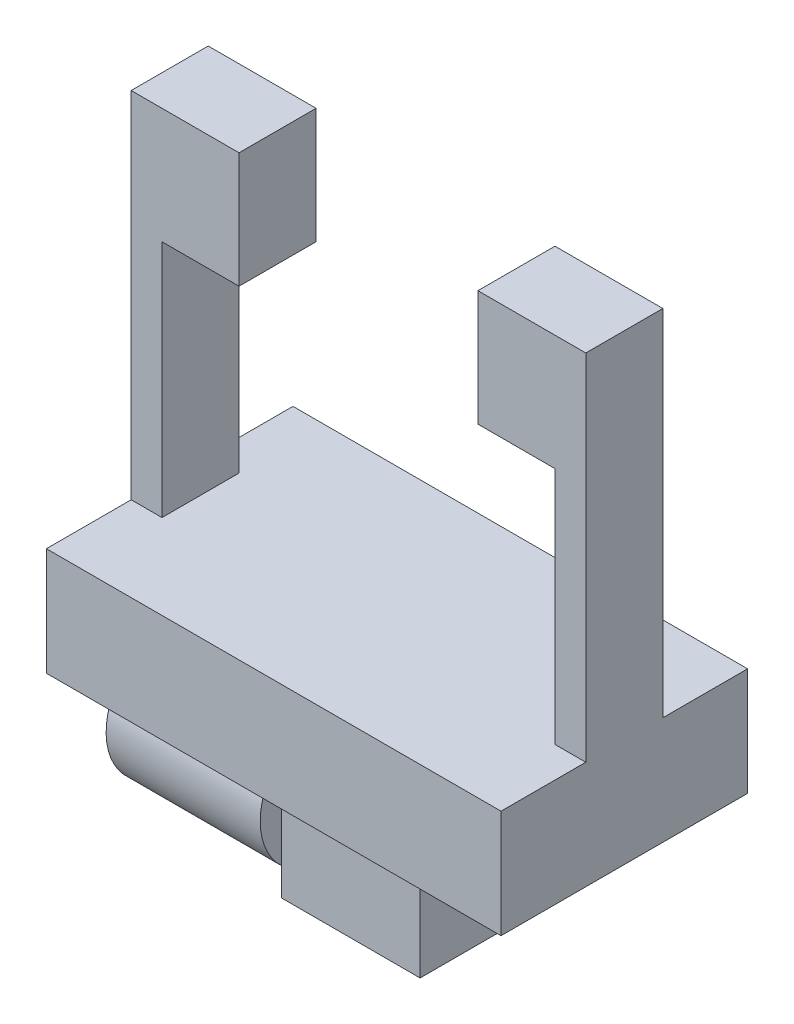
ISO-10303-21;
HEADER;
FILE_DESCRIPTION(('STEP AP214'),'2;1');
FILE_NAME('part.step','',(''),(''),'','','');
FILE_SCHEMA(('AUTOMOTIVE_DESIGN { 1 0 10303 214 1 1 1 1 }'));
ENDSEC;
DATA;
#1=APPLICATION_CONTEXT('core data for automotive mechanical design processes');
#2=APPLICATION_PROTOCOL_DEFINITION('international standard','automotive_design',2000,#1);
#3=PRODUCT_CONTEXT('',#1,'mechanical');
#4=PRODUCT('Part','Part','',(#3));
#5=PRODUCT_RELATED_PRODUCT_CATEGORY('part','',(#4));
#6=PRODUCT_DEFINITION_FORMATION('','',#4);
#7=PRODUCT_DEFINITION_CONTEXT('part definition',#1,'design');
#8=PRODUCT_DEFINITION('design','',#6,#7);
#9=PRODUCT_DEFINITION_SHAPE('','',#8);
#10=(LENGTH_UNIT() NAMED_UNIT(*) SI_UNIT(.MILLI.,.METRE.));
#11=(NAMED_UNIT(*) PLANE_ANGLE_UNIT() SI_UNIT($,.RADIAN.));
#12=(NAMED_UNIT(*) SI_UNIT($,.STERADIAN.) SOLID_ANGLE_UNIT());
#13=UNCERTAINTY_MEASURE_WITH_UNIT(LENGTH_MEASURE(1.E-05),#10,'distance_accuracy_value','');
#14=(GEOMETRIC_REPRESENTATION_CONTEXT(3) GLOBAL_UNCERTAINTY_ASSIGNED_CONTEXT((#13)) GLOBAL_UNIT_ASSIGNED_CONTEXT((#10,
#11,#12)) REPRESENTATION_CONTEXT('',''));
#15=CARTESIAN_POINT('',(0.,0.,0.));
#16=DIRECTION('',(0.,0.,1.));
#17=DIRECTION('',(1.,0.,0.));
#18=AXIS2_PLACEMENT_3D('',#15,#16,#17);
#19=CARTESIAN_POINT('',(-11.43,-8.89,7.62));
#20=DIRECTION('',(1.,0.,0.));
#21=DIRECTION('',(0.,1.,0.));
#22=AXIS2_PLACEMENT_3D('',#19,#20,#21);
#23=PLANE('',#22);
#24=CARTESIAN_POINT('',(-11.43,-21.59,0.));
#25=DIRECTION('',(-1.,0.,0.));
#26=DIRECTION('',(0.,-1.,0.));
#27=AXIS2_PLACEMENT_3D('',#24,#25,#26);
#28=CIRCLE('',#27,11.1125);
#29=CARTESIAN_POINT('',(-11.43,-13.5015356061858,7.62));
#30=VERTEX_POINT('',#29);
#31=CARTESIAN_POINT('',(-11.43,-13.5015356061858,-7.62));
#32=VERTEX_POINT('',#31);
#33=EDGE_CURVE('E1946',#30,#32,#28,.T.);
#34=ORIENTED_EDGE('',*,*,#33,.F.);
#35=DIRECTION('',(0.,-1.,0.));
#36=VECTOR('',#35,1.);
#37=CARTESIAN_POINT('',(-11.43,-8.89,7.62));
#38=LINE('',#37,#36);
#39=CARTESIAN_POINT('',(-11.43,-8.89,7.62));
#40=VERTEX_POINT('',#39);
#41=EDGE_CURVE('E2090',#40,#30,#38,.T.);
#42=ORIENTED_EDGE('',*,*,#41,.F.);
#43=DIRECTION('',(0.,0.,-1.));
#44=VECTOR('',#43,1.);
#45=CARTESIAN_POINT('',(-11.43,-8.89,7.62));
#46=LINE('',#45,#44);
#47=CARTESIAN_POINT('',(-11.43,-8.89,-7.62));
#48=VERTEX_POINT('',#47);
#49=EDGE_CURVE('E2129',#40,#48,#46,.T.);
#50=ORIENTED_EDGE('',*,*,#49,.T.);
#51=DIRECTION('',(0.,-1.,0.));
#52=VECTOR('',#51,1.);
#53=CARTESIAN_POINT('',(-11.43,-8.89,-7.62));
#54=LINE('',#53,#52);
#55=EDGE_CURVE('E2131',#48,#32,#54,.T.);
#56=ORIENTED_EDGE('',*,*,#55,.T.);
#57=EDGE_LOOP('',(#34,#42,#50,#56));
#58=FACE_BOUND('',#57,.T.);
#59=ADVANCED_FACE('F1932',(#58),#23,.F.);
#60=CARTESIAN_POINT('',(37.465,-8.89,20.32));
#61=DIRECTION('',(-1.,0.,0.));
#62=DIRECTION('',(0.,0.,1.));
#63=AXIS2_PLACEMENT_3D('',#60,#61,#62);
#64=PLANE('',#63);
#65=DIRECTION('',(0.,1.,0.));
#66=VECTOR('',#65,1.);
#67=CARTESIAN_POINT('',(37.465,-8.89,-20.32));
#68=LINE('',#67,#66);
#69=CARTESIAN_POINT('',(37.465,-8.89,-20.32));
#70=VERTEX_POINT('',#69);
#71=CARTESIAN_POINT('',(37.465,8.89,-20.32));
#72=VERTEX_POINT('',#71);
#73=EDGE_CURVE('E2251',#70,#72,#68,.T.);
#74=ORIENTED_EDGE('',*,*,#73,.T.);
#75=DIRECTION('',(0.,0.,-1.));
#76=VECTOR('',#75,1.);
#77=CARTESIAN_POINT('',(37.465,8.89,20.32));
#78=LINE('',#77,#76);
#79=CARTESIAN_POINT('',(37.465,8.89,-6.35));
#80=VERTEX_POINT('',#79);
#81=EDGE_CURVE('E1944',#80,#72,#78,.T.);
#82=ORIENTED_EDGE('',*,*,#81,.F.);
#83=DIRECTION('',(0.,1.,0.));
#84=VECTOR('',#83,1.);
#85=CARTESIAN_POINT('',(37.465,8.89,-6.35));
#86=LINE('',#85,#84);
#87=CARTESIAN_POINT('',(37.465,67.31,-6.35));
#88=VERTEX_POINT('',#87);
#89=EDGE_CURVE('E2238',#80,#88,#86,.T.);
#90=ORIENTED_EDGE('',*,*,#89,.T.);
#91=DIRECTION('',(0.,0.,-1.));
#92=VECTOR('',#91,1.);
#93=CARTESIAN_POINT('',(37.465,67.31,6.35));
#94=LINE('',#93,#92);
#95=CARTESIAN_POINT('',(37.465,67.31,6.35));
#96=VERTEX_POINT('',#95);
#97=EDGE_CURVE('E2186',#96,#88,#94,.T.);
#98=ORIENTED_EDGE('',*,*,#97,.F.);
#99=DIRECTION('',(0.,1.,0.));
#100=VECTOR('',#99,1.);
#101=CARTESIAN_POINT('',(37.465,8.89,6.35));
#102=LINE('',#101,#100);
#103=CARTESIAN_POINT('',(37.465,8.89,6.35));
#104=VERTEX_POINT('',#103);
#105=EDGE_CURVE('E2264',#104,#96,#102,.T.);
#106=ORIENTED_EDGE('',*,*,#105,.F.);
#107=CARTESIAN_POINT('',(37.465,8.89,20.32));
#108=VERTEX_POINT('',#107);
#109=EDGE_CURVE('E12',#108,#104,#78,.T.);
#110=ORIENTED_EDGE('',*,*,#109,.F.);
#111=DIRECTION('',(0.,1.,0.));
#112=VECTOR('',#111,1.);
#113=CARTESIAN_POINT('',(37.465,-8.89,20.32));
#114=LINE('',#113,#112);
#115=CARTESIAN_POINT('',(37.465,-8.89,20.32));
#116=VERTEX_POINT('',#115);
#117=EDGE_CURVE('E2280',#116,#108,#114,.T.);
#118=ORIENTED_EDGE('',*,*,#117,.F.);
#119=DIRECTION('',(0.,0.,-1.));
#120=VECTOR('',#119,1.);
#121=CARTESIAN_POINT('',(37.465,-8.89,20.32));
#122=LINE('',#121,#120);
#123=EDGE_CURVE('E2294',#116,#70,#122,.T.);
#124=ORIENTED_EDGE('',*,*,#123,.T.);
#125=EDGE_LOOP('',(#74,#82,#90,#98,#106,#110,#118,#124));
#126=FACE_BOUND('',#125,.T.);
#127=ADVANCED_FACE('F1936',(#126),#64,.F.);
#128=CARTESIAN_POINT('',(-37.465,8.89,20.32));
#129=DIRECTION('',(0.,-1.,0.));
#130=DIRECTION('',(0.,0.,-1.));
#131=AXIS2_PLACEMENT_3D('',#128,#129,#130);
#132=PLANE('',#131);
#133=DIRECTION('',(0.,0.,-1.));
#134=VECTOR('',#133,1.);
#135=CARTESIAN_POINT('',(-37.465,8.89,20.32));
#136=LINE('',#135,#134);
#137=CARTESIAN_POINT('',(-37.465,8.89,-6.35));
#138=VERTEX_POINT('',#137);
#139=CARTESIAN_POINT('',(-37.465,8.89,-20.32));
#140=VERTEX_POINT('',#139);
#141=EDGE_CURVE('E2313',#138,#140,#136,.T.);
#142=ORIENTED_EDGE('',*,*,#141,.F.);
#143=DIRECTION('',(1.,0.,0.));
#144=VECTOR('',#143,1.);
#145=CARTESIAN_POINT('',(-37.465,8.89,-6.35));
#146=LINE('',#145,#144);
#147=CARTESIAN_POINT('',(-32.385,8.89,-6.35));
#148=VERTEX_POINT('',#147);
#149=EDGE_CURVE('E2239',#138,#148,#146,.T.);
#150=ORIENTED_EDGE('',*,*,#149,.T.);
#151=DIRECTION('',(0.,0.,-1.));
#152=VECTOR('',#151,1.);
#153=CARTESIAN_POINT('',(-32.385,8.89,6.35));
#154=LINE('',#153,#152);
#155=CARTESIAN_POINT('',(-32.385,8.89,6.35));
#156=VERTEX_POINT('',#155);
#157=EDGE_CURVE('E2250',#156,#148,#154,.T.);
#158=ORIENTED_EDGE('',*,*,#157,.F.);
#159=DIRECTION('',(1.,0.,0.));
#160=VECTOR('',#159,1.);
#161=CARTESIAN_POINT('',(-37.465,8.89,6.35));
#162=LINE('',#161,#160);
#163=CARTESIAN_POINT('',(-37.465,8.89,6.35));
#164=VERTEX_POINT('',#163);
#165=EDGE_CURVE('E2223',#164,#156,#162,.T.);
#166=ORIENTED_EDGE('',*,*,#165,.F.);
#167=CARTESIAN_POINT('',(-37.465,8.89,20.32));
#168=VERTEX_POINT('',#167);
#169=EDGE_CURVE('E2315',#168,#164,#136,.T.);
#170=ORIENTED_EDGE('',*,*,#169,.F.);
#171=DIRECTION('',(-1.,0.,0.));
#172=VECTOR('',#171,1.);
#173=CARTESIAN_POINT('',(-37.465,8.89,20.32));
#174=LINE('',#173,#172);
#175=EDGE_CURVE('E2282',#108,#168,#174,.T.);
#176=ORIENTED_EDGE('',*,*,#175,.F.);
#177=ORIENTED_EDGE('',*,*,#109,.T.);
#178=DIRECTION('',(1.,0.,0.));
#179=VECTOR('',#178,1.);
#180=CARTESIAN_POINT('',(37.465,8.89,6.35));
#181=LINE('',#180,#179);
#182=CARTESIAN_POINT('',(32.385,8.89,6.35));
#183=VERTEX_POINT('',#182);
#184=EDGE_CURVE('E2257',#183,#104,#181,.T.);
#185=ORIENTED_EDGE('',*,*,#184,.F.);
#186=DIRECTION('',(0.,0.,-1.));
#187=VECTOR('',#186,1.);
#188=CARTESIAN_POINT('',(32.385,8.89,6.35));
#189=LINE('',#188,#187);
#190=CARTESIAN_POINT('',(32.385,8.89,-6.35));
#191=VERTEX_POINT('',#190);
#192=EDGE_CURVE('E2254',#183,#191,#189,.T.);
#193=ORIENTED_EDGE('',*,*,#192,.T.);
#194=DIRECTION('',(1.,0.,0.));
#195=VECTOR('',#194,1.);
#196=CARTESIAN_POINT('',(37.465,8.89,-6.35));
#197=LINE('',#196,#195);
#198=EDGE_CURVE('E2259',#191,#80,#197,.T.);
#199=ORIENTED_EDGE('',*,*,#198,.T.);
#200=ORIENTED_EDGE('',*,*,#81,.T.);
#201=DIRECTION('',(-1.,0.,0.));
#202=VECTOR('',#201,1.);
#203=CARTESIAN_POINT('',(-37.465,8.89,-20.32));
#204=LINE('',#203,#202);
#205=EDGE_CURVE('E2299',#72,#140,#204,.T.);
#206=ORIENTED_EDGE('',*,*,#205,.T.);
#207=EDGE_LOOP('',(#142,#150,#158,#166,#170,#176,#177,#185,#193,#199,#200,#206));
#208=FACE_BOUND('',#207,.T.);
#209=ADVANCED_FACE('F2327',(#208),#132,.F.);
#210=CARTESIAN_POINT('',(-37.465,-8.89,20.32));
#211=DIRECTION('',(1.,0.,0.));
#212=DIRECTION('',(0.,0.,-1.));
#213=AXIS2_PLACEMENT_3D('',#210,#211,#212);
#214=PLANE('',#213);
#215=DIRECTION('',(0.,-1.,0.));
#216=VECTOR('',#215,1.);
#217=CARTESIAN_POINT('',(-37.465,-8.89,-20.32));
#218=LINE('',#217,#216);
#219=CARTESIAN_POINT('',(-37.465,-8.89,-20.32));
#220=VERTEX_POINT('',#219);
#221=EDGE_CURVE('E2297',#140,#220,#218,.T.);
#222=ORIENTED_EDGE('',*,*,#221,.T.);
#223=DIRECTION('',(0.,0.,-1.));
#224=VECTOR('',#223,1.);
#225=CARTESIAN_POINT('',(-37.465,-8.89,20.32));
#226=LINE('',#225,#224);
#227=CARTESIAN_POINT('',(-37.465,-8.89,20.32));
#228=VERTEX_POINT('',#227);
#229=EDGE_CURVE('E2306',#228,#220,#226,.T.);
#230=ORIENTED_EDGE('',*,*,#229,.F.);
#231=DIRECTION('',(0.,-1.,0.));
#232=VECTOR('',#231,1.);
#233=CARTESIAN_POINT('',(-37.465,-8.89,20.32));
#234=LINE('',#233,#232);
#235=EDGE_CURVE('E2287',#168,#228,#234,.T.);
#236=ORIENTED_EDGE('',*,*,#235,.F.);
#237=ORIENTED_EDGE('',*,*,#169,.T.);
#238=DIRECTION('',(0.,-1.,0.));
#239=VECTOR('',#238,1.);
#240=CARTESIAN_POINT('',(-37.465,8.89,6.35));
#241=LINE('',#240,#239);
#242=CARTESIAN_POINT('',(-37.465,67.31,6.35));
#243=VERTEX_POINT('',#242);
#244=EDGE_CURVE('E2222',#243,#164,#241,.T.);
#245=ORIENTED_EDGE('',*,*,#244,.F.);
#246=DIRECTION('',(0.,0.,-1.));
#247=VECTOR('',#246,1.);
#248=CARTESIAN_POINT('',(-37.465,67.31,6.35));
#249=LINE('',#248,#247);
#250=CARTESIAN_POINT('',(-37.465,67.31,-6.35));
#251=VERTEX_POINT('',#250);
#252=EDGE_CURVE('E2197',#243,#251,#249,.T.);
#253=ORIENTED_EDGE('',*,*,#252,.T.);
#254=DIRECTION('',(0.,-1.,0.));
#255=VECTOR('',#254,1.);
#256=CARTESIAN_POINT('',(-37.465,8.89,-6.35));
#257=LINE('',#256,#255);
#258=EDGE_CURVE('E2233',#251,#138,#257,.T.);
#259=ORIENTED_EDGE('',*,*,#258,.T.);
#260=ORIENTED_EDGE('',*,*,#141,.T.);
#261=EDGE_LOOP('',(#222,#230,#236,#237,#245,#253,#259,#260));
#262=FACE_BOUND('',#261,.T.);
#263=ADVANCED_FACE('F2325',(#262),#214,.F.);
#264=CARTESIAN_POINT('',(-37.465,-8.89,20.32));
#265=DIRECTION('',(0.,1.,0.));
#266=DIRECTION('',(0.,0.,1.));
#267=AXIS2_PLACEMENT_3D('',#264,#265,#266);
#268=PLANE('',#267);
#269=DIRECTION('',(0.,0.,-1.));
#270=VECTOR('',#269,1.);
#271=CARTESIAN_POINT('',(11.43,-8.89,7.62));
#272=LINE('',#271,#270);
#273=CARTESIAN_POINT('',(11.43,-8.89,7.62));
#274=VERTEX_POINT('',#273);
#275=CARTESIAN_POINT('',(11.43,-8.89,-7.62));
#276=VERTEX_POINT('',#275);
#277=EDGE_CURVE('E2146',#274,#276,#272,.T.);
#278=ORIENTED_EDGE('',*,*,#277,.T.);
#279=DIRECTION('',(-1.,0.,0.));
#280=VECTOR('',#279,1.);
#281=CARTESIAN_POINT('',(-11.43,-8.89,-7.62));
#282=LINE('',#281,#280);
#283=EDGE_CURVE('E2105',#276,#48,#282,.T.);
#284=ORIENTED_EDGE('',*,*,#283,.T.);
#285=ORIENTED_EDGE('',*,*,#49,.F.);
#286=DIRECTION('',(-1.,0.,0.));
#287=VECTOR('',#286,1.);
#288=CARTESIAN_POINT('',(-11.43,-8.89,7.62));
#289=LINE('',#288,#287);
#290=EDGE_CURVE('E2130',#274,#40,#289,.T.);
#291=ORIENTED_EDGE('',*,*,#290,.F.);
#292=EDGE_LOOP('',(#278,#284,#285,#291));
#293=FACE_BOUND('',#292,.T.);
#294=DIRECTION('',(1.,0.,0.));
#295=VECTOR('',#294,1.);
#296=CARTESIAN_POINT('',(-37.465,-8.89,-20.32));
#297=LINE('',#296,#295);
#298=EDGE_CURVE('E2284',#220,#70,#297,.T.);
#299=ORIENTED_EDGE('',*,*,#298,.T.);
#300=ORIENTED_EDGE('',*,*,#123,.F.);
#301=DIRECTION('',(1.,0.,0.));
#302=VECTOR('',#301,1.);
#303=CARTESIAN_POINT('',(-37.465,-8.89,20.32));
#304=LINE('',#303,#302);
#305=EDGE_CURVE('E2289',#228,#116,#304,.T.);
#306=ORIENTED_EDGE('',*,*,#305,.F.);
#307=ORIENTED_EDGE('',*,*,#229,.T.);
#308=EDGE_LOOP('',(#299,#300,#306,#307));
#309=FACE_BOUND('',#308,.T.);
#310=ADVANCED_FACE('F2338',(#293,#309),#268,.F.);
#311=CARTESIAN_POINT('',(0.,0.,20.32));
#312=DIRECTION('',(0.,0.,-1.));
#313=DIRECTION('',(-1.,0.,0.));
#314=AXIS2_PLACEMENT_3D('',#311,#312,#313);
#315=PLANE('',#314);
#316=ORIENTED_EDGE('',*,*,#117,.T.);
#317=ORIENTED_EDGE('',*,*,#175,.T.);
#318=ORIENTED_EDGE('',*,*,#235,.T.);
#319=ORIENTED_EDGE('',*,*,#305,.T.);
#320=EDGE_LOOP('',(#316,#317,#318,#319));
#321=FACE_BOUND('',#320,.T.);
#322=ADVANCED_FACE('F2345',(#321),#315,.F.);
#323=CARTESIAN_POINT('',(0.,0.,-20.32));
#324=DIRECTION('',(0.,0.,-1.));
#325=DIRECTION('',(-1.,0.,0.));
#326=AXIS2_PLACEMENT_3D('',#323,#324,#325);
#327=PLANE('',#326);
#328=ORIENTED_EDGE('',*,*,#73,.F.);
#329=ORIENTED_EDGE('',*,*,#298,.F.);
#330=ORIENTED_EDGE('',*,*,#221,.F.);
#331=ORIENTED_EDGE('',*,*,#205,.F.);
#332=EDGE_LOOP('',(#328,#329,#330,#331));
#333=FACE_BOUND('',#332,.T.);
#334=ADVANCED_FACE('F2334',(#333),#327,.T.);
#335=CARTESIAN_POINT('',(32.385,8.89,6.35));
#336=DIRECTION('',(1.,0.,0.));
#337=DIRECTION('',(0.,0.,-1.));
#338=AXIS2_PLACEMENT_3D('',#335,#336,#337);
#339=PLANE('',#338);
#340=DIRECTION('',(0.,-1.,0.));
#341=VECTOR('',#340,1.);
#342=CARTESIAN_POINT('',(32.385,8.89,-6.35));
#343=LINE('',#342,#341);
#344=CARTESIAN_POINT('',(32.385,48.26,-6.35));
#345=VERTEX_POINT('',#344);
#346=EDGE_CURVE('E2263',#345,#191,#343,.T.);
#347=ORIENTED_EDGE('',*,*,#346,.T.);
#348=ORIENTED_EDGE('',*,*,#192,.F.);
#349=DIRECTION('',(0.,-1.,0.));
#350=VECTOR('',#349,1.);
#351=CARTESIAN_POINT('',(32.385,8.89,6.35));
#352=LINE('',#351,#350);
#353=CARTESIAN_POINT('',(32.385,48.26,6.35));
#354=VERTEX_POINT('',#353);
#355=EDGE_CURVE('E2272',#354,#183,#352,.T.);
#356=ORIENTED_EDGE('',*,*,#355,.F.);
#357=DIRECTION('',(0.,0.,-1.));
#358=VECTOR('',#357,1.);
#359=CARTESIAN_POINT('',(32.385,48.26,6.35));
#360=LINE('',#359,#358);
#361=EDGE_CURVE('E2189',#354,#345,#360,.T.);
#362=ORIENTED_EDGE('',*,*,#361,.T.);
#363=EDGE_LOOP('',(#347,#348,#356,#362));
#364=FACE_BOUND('',#363,.T.);
#365=ADVANCED_FACE('F2688',(#364),#339,.F.);
#366=CARTESIAN_POINT('',(0.,0.,6.35));
#367=DIRECTION('',(0.,0.,1.));
#368=DIRECTION('',(1.,0.,0.));
#369=AXIS2_PLACEMENT_3D('',#366,#367,#368);
#370=PLANE('',#369);
#371=ORIENTED_EDGE('',*,*,#105,.T.);
#372=DIRECTION('',(-1.,0.,0.));
#373=VECTOR('',#372,1.);
#374=CARTESIAN_POINT('',(37.465,67.31,6.35));
#375=LINE('',#374,#373);
#376=CARTESIAN_POINT('',(19.685,67.31,6.35));
#377=VERTEX_POINT('',#376);
#378=EDGE_CURVE('E2156',#96,#377,#375,.T.);
#379=ORIENTED_EDGE('',*,*,#378,.T.);
#380=DIRECTION('',(0.,-1.,0.));
#381=VECTOR('',#380,1.);
#382=CARTESIAN_POINT('',(19.685,48.26,6.35));
#383=LINE('',#382,#381);
#384=CARTESIAN_POINT('',(19.685,48.26,6.35));
#385=VERTEX_POINT('',#384);
#386=EDGE_CURVE('E2163',#377,#385,#383,.T.);
#387=ORIENTED_EDGE('',*,*,#386,.T.);
#388=DIRECTION('',(1.,0.,0.));
#389=VECTOR('',#388,1.);
#390=CARTESIAN_POINT('',(37.465,48.26,6.35));
#391=LINE('',#390,#389);
#392=EDGE_CURVE('E2161',#385,#354,#391,.T.);
#393=ORIENTED_EDGE('',*,*,#392,.T.);
#394=ORIENTED_EDGE('',*,*,#355,.T.);
#395=ORIENTED_EDGE('',*,*,#184,.T.);
#396=EDGE_LOOP('',(#371,#379,#387,#393,#394,#395));
#397=FACE_BOUND('',#396,.T.);
#398=ADVANCED_FACE('F2694',(#397),#370,.T.);
#399=CARTESIAN_POINT('',(0.,0.,-6.35));
#400=DIRECTION('',(0.,0.,1.));
#401=DIRECTION('',(1.,0.,0.));
#402=AXIS2_PLACEMENT_3D('',#399,#400,#401);
#403=PLANE('',#402);
#404=ORIENTED_EDGE('',*,*,#89,.F.);
#405=ORIENTED_EDGE('',*,*,#198,.F.);
#406=ORIENTED_EDGE('',*,*,#346,.F.);
#407=DIRECTION('',(1.,0.,0.));
#408=VECTOR('',#407,1.);
#409=CARTESIAN_POINT('',(37.465,48.26,-6.35));
#410=LINE('',#409,#408);
#411=CARTESIAN_POINT('',(19.685,48.26,-6.35));
#412=VERTEX_POINT('',#411);
#413=EDGE_CURVE('E2164',#412,#345,#410,.T.);
#414=ORIENTED_EDGE('',*,*,#413,.F.);
#415=DIRECTION('',(0.,-1.,0.));
#416=VECTOR('',#415,1.);
#417=CARTESIAN_POINT('',(19.685,48.26,-6.35));
#418=LINE('',#417,#416);
#419=CARTESIAN_POINT('',(19.685,67.31,-6.35));
#420=VERTEX_POINT('',#419);
#421=EDGE_CURVE('E2174',#420,#412,#418,.T.);
#422=ORIENTED_EDGE('',*,*,#421,.F.);
#423=DIRECTION('',(-1.,0.,0.));
#424=VECTOR('',#423,1.);
#425=CARTESIAN_POINT('',(37.465,67.31,-6.35));
#426=LINE('',#425,#424);
#427=EDGE_CURVE('E2167',#88,#420,#426,.T.);
#428=ORIENTED_EDGE('',*,*,#427,.F.);
#429=EDGE_LOOP('',(#404,#405,#406,#414,#422,#428));
#430=FACE_BOUND('',#429,.T.);
#431=ADVANCED_FACE('F2705',(#430),#403,.F.);
#432=CARTESIAN_POINT('',(-32.385,8.89,6.35));
#433=DIRECTION('',(-1.,0.,0.));
#434=DIRECTION('',(0.,0.,1.));
#435=AXIS2_PLACEMENT_3D('',#432,#433,#434);
#436=PLANE('',#435);
#437=DIRECTION('',(0.,1.,0.));
#438=VECTOR('',#437,1.);
#439=CARTESIAN_POINT('',(-32.385,8.89,-6.35));
#440=LINE('',#439,#438);
#441=CARTESIAN_POINT('',(-32.385,48.26,-6.35));
#442=VERTEX_POINT('',#441);
#443=EDGE_CURVE('E2228',#148,#442,#440,.T.);
#444=ORIENTED_EDGE('',*,*,#443,.T.);
#445=DIRECTION('',(0.,0.,-1.));
#446=VECTOR('',#445,1.);
#447=CARTESIAN_POINT('',(-32.385,48.26,6.35));
#448=LINE('',#447,#446);
#449=CARTESIAN_POINT('',(-32.385,48.26,6.35));
#450=VERTEX_POINT('',#449);
#451=EDGE_CURVE('E2235',#450,#442,#448,.T.);
#452=ORIENTED_EDGE('',*,*,#451,.F.);
#453=DIRECTION('',(0.,1.,0.));
#454=VECTOR('',#453,1.);
#455=CARTESIAN_POINT('',(-32.385,8.89,6.35));
#456=LINE('',#455,#454);
#457=EDGE_CURVE('E2226',#156,#450,#456,.T.);
#458=ORIENTED_EDGE('',*,*,#457,.F.);
#459=ORIENTED_EDGE('',*,*,#157,.T.);
#460=EDGE_LOOP('',(#444,#452,#458,#459));
#461=FACE_BOUND('',#460,.T.);
#462=ADVANCED_FACE('F2348',(#461),#436,.F.);
#463=CARTESIAN_POINT('',(0.,0.,6.35));
#464=DIRECTION('',(0.,0.,-1.));
#465=DIRECTION('',(-1.,0.,0.));
#466=AXIS2_PLACEMENT_3D('',#463,#464,#465);
#467=PLANE('',#466);
#468=ORIENTED_EDGE('',*,*,#244,.T.);
#469=ORIENTED_EDGE('',*,*,#165,.T.);
#470=ORIENTED_EDGE('',*,*,#457,.T.);
#471=DIRECTION('',(1.,0.,0.));
#472=VECTOR('',#471,1.);
#473=CARTESIAN_POINT('',(-37.465,48.26,6.35));
#474=LINE('',#473,#472);
#475=CARTESIAN_POINT('',(-19.685,48.26,6.35));
#476=VERTEX_POINT('',#475);
#477=EDGE_CURVE('E2207',#450,#476,#474,.T.);
#478=ORIENTED_EDGE('',*,*,#477,.T.);
#479=DIRECTION('',(0.,1.,0.));
#480=VECTOR('',#479,1.);
#481=CARTESIAN_POINT('',(-19.685,48.26,6.35));
#482=LINE('',#481,#480);
#483=CARTESIAN_POINT('',(-19.685,67.31,6.35));
#484=VERTEX_POINT('',#483);
#485=EDGE_CURVE('E2216',#476,#484,#482,.T.);
#486=ORIENTED_EDGE('',*,*,#485,.T.);
#487=DIRECTION('',(-1.,0.,0.));
#488=VECTOR('',#487,1.);
#489=CARTESIAN_POINT('',(-37.465,67.31,6.35));
#490=LINE('',#489,#488);
#491=EDGE_CURVE('E2205',#484,#243,#490,.T.);
#492=ORIENTED_EDGE('',*,*,#491,.T.);
#493=EDGE_LOOP('',(#468,#469,#470,#478,#486,#492));
#494=FACE_BOUND('',#493,.T.);
#495=ADVANCED_FACE('F2346',(#494),#467,.F.);
#496=CARTESIAN_POINT('',(0.,0.,-6.35));
#497=DIRECTION('',(0.,0.,-1.));
#498=DIRECTION('',(-1.,0.,0.));
#499=AXIS2_PLACEMENT_3D('',#496,#497,#498);
#500=PLANE('',#499);
#501=ORIENTED_EDGE('',*,*,#258,.F.);
#502=DIRECTION('',(-1.,0.,0.));
#503=VECTOR('',#502,1.);
#504=CARTESIAN_POINT('',(-37.465,67.31,-6.35));
#505=LINE('',#504,#503);
#506=CARTESIAN_POINT('',(-19.685,67.31,-6.35));
#507=VERTEX_POINT('',#506);
#508=EDGE_CURVE('E2204',#507,#251,#505,.T.);
#509=ORIENTED_EDGE('',*,*,#508,.F.);
#510=DIRECTION('',(0.,1.,0.));
#511=VECTOR('',#510,1.);
#512=CARTESIAN_POINT('',(-19.685,48.26,-6.35));
#513=LINE('',#512,#511);
#514=CARTESIAN_POINT('',(-19.685,48.26,-6.35));
#515=VERTEX_POINT('',#514);
#516=EDGE_CURVE('E2209',#515,#507,#513,.T.);
#517=ORIENTED_EDGE('',*,*,#516,.F.);
#518=DIRECTION('',(1.,0.,0.));
#519=VECTOR('',#518,1.);
#520=CARTESIAN_POINT('',(-37.465,48.26,-6.35));
#521=LINE('',#520,#519);
#522=EDGE_CURVE('E2173',#442,#515,#521,.T.);
#523=ORIENTED_EDGE('',*,*,#522,.F.);
#524=ORIENTED_EDGE('',*,*,#443,.F.);
#525=ORIENTED_EDGE('',*,*,#149,.F.);
#526=EDGE_LOOP('',(#501,#509,#517,#523,#524,#525));
#527=FACE_BOUND('',#526,.T.);
#528=ADVANCED_FACE('F2367',(#527),#500,.T.);
#529=CARTESIAN_POINT('',(-37.465,48.26,6.35));
#530=DIRECTION('',(0.,1.,0.));
#531=DIRECTION('',(0.,0.,1.));
#532=AXIS2_PLACEMENT_3D('',#529,#530,#531);
#533=PLANE('',#532);
#534=ORIENTED_EDGE('',*,*,#477,.F.);
#535=ORIENTED_EDGE('',*,*,#451,.T.);
#536=ORIENTED_EDGE('',*,*,#522,.T.);
#537=DIRECTION('',(0.,0.,-1.));
#538=VECTOR('',#537,1.);
#539=CARTESIAN_POINT('',(-19.685,48.26,6.35));
#540=LINE('',#539,#538);
#541=EDGE_CURVE('E2160',#476,#515,#540,.T.);
#542=ORIENTED_EDGE('',*,*,#541,.F.);
#543=EDGE_LOOP('',(#534,#535,#536,#542));
#544=FACE_BOUND('',#543,.T.);
#545=ADVANCED_FACE('F2353',(#544),#533,.F.);
#546=CARTESIAN_POINT('',(-19.685,48.26,6.35));
#547=DIRECTION('',(-1.,0.,0.));
#548=DIRECTION('',(0.,0.,1.));
#549=AXIS2_PLACEMENT_3D('',#546,#547,#548);
#550=PLANE('',#549);
#551=ORIENTED_EDGE('',*,*,#516,.T.);
#552=DIRECTION('',(0.,0.,-1.));
#553=VECTOR('',#552,1.);
#554=CARTESIAN_POINT('',(-19.685,67.31,6.35));
#555=LINE('',#554,#553);
#556=EDGE_CURVE('E2192',#484,#507,#555,.T.);
#557=ORIENTED_EDGE('',*,*,#556,.F.);
#558=ORIENTED_EDGE('',*,*,#485,.F.);
#559=ORIENTED_EDGE('',*,*,#541,.T.);
#560=EDGE_LOOP('',(#551,#557,#558,#559));
#561=FACE_BOUND('',#560,.T.);
#562=ADVANCED_FACE('F2364',(#561),#550,.F.);
#563=CARTESIAN_POINT('',(-37.465,67.31,6.35));
#564=DIRECTION('',(0.,-1.,0.));
#565=DIRECTION('',(0.,0.,-1.));
#566=AXIS2_PLACEMENT_3D('',#563,#564,#565);
#567=PLANE('',#566);
#568=ORIENTED_EDGE('',*,*,#508,.T.);
#569=ORIENTED_EDGE('',*,*,#252,.F.);
#570=ORIENTED_EDGE('',*,*,#491,.F.);
#571=ORIENTED_EDGE('',*,*,#556,.T.);
#572=EDGE_LOOP('',(#568,#569,#570,#571));
#573=FACE_BOUND('',#572,.T.);
#574=ADVANCED_FACE('F2362',(#573),#567,.F.);
#575=CARTESIAN_POINT('',(37.465,67.31,6.35));
#576=DIRECTION('',(0.,-1.,0.));
#577=DIRECTION('',(0.,0.,-1.));
#578=AXIS2_PLACEMENT_3D('',#575,#576,#577);
#579=PLANE('',#578);
#580=ORIENTED_EDGE('',*,*,#427,.T.);
#581=DIRECTION('',(0.,0.,-1.));
#582=VECTOR('',#581,1.);
#583=CARTESIAN_POINT('',(19.685,67.31,6.35));
#584=LINE('',#583,#582);
#585=EDGE_CURVE('E2185',#377,#420,#584,.T.);
#586=ORIENTED_EDGE('',*,*,#585,.F.);
#587=ORIENTED_EDGE('',*,*,#378,.F.);
#588=ORIENTED_EDGE('',*,*,#97,.T.);
#589=EDGE_LOOP('',(#580,#586,#587,#588));
#590=FACE_BOUND('',#589,.T.);
#591=ADVANCED_FACE('F2403',(#590),#579,.F.);
#592=CARTESIAN_POINT('',(19.685,48.26,6.35));
#593=DIRECTION('',(1.,0.,0.));
#594=DIRECTION('',(0.,0.,-1.));
#595=AXIS2_PLACEMENT_3D('',#592,#593,#594);
#596=PLANE('',#595);
#597=ORIENTED_EDGE('',*,*,#421,.T.);
#598=DIRECTION('',(0.,0.,-1.));
#599=VECTOR('',#598,1.);
#600=CARTESIAN_POINT('',(19.685,48.26,6.35));
#601=LINE('',#600,#599);
#602=EDGE_CURVE('E2168',#385,#412,#601,.T.);
#603=ORIENTED_EDGE('',*,*,#602,.F.);
#604=ORIENTED_EDGE('',*,*,#386,.F.);
#605=ORIENTED_EDGE('',*,*,#585,.T.);
#606=EDGE_LOOP('',(#597,#603,#604,#605));
#607=FACE_BOUND('',#606,.T.);
#608=ADVANCED_FACE('F2394',(#607),#596,.F.);
#609=CARTESIAN_POINT('',(37.465,48.26,6.35));
#610=DIRECTION('',(0.,1.,0.));
#611=DIRECTION('',(0.,0.,1.));
#612=AXIS2_PLACEMENT_3D('',#609,#610,#611);
#613=PLANE('',#612);
#614=ORIENTED_EDGE('',*,*,#361,.F.);
#615=ORIENTED_EDGE('',*,*,#392,.F.);
#616=ORIENTED_EDGE('',*,*,#602,.T.);
#617=ORIENTED_EDGE('',*,*,#413,.T.);
#618=EDGE_LOOP('',(#614,#615,#616,#617));
#619=FACE_BOUND('',#618,.T.);
#620=ADVANCED_FACE('F2390',(#619),#613,.F.);
#621=CARTESIAN_POINT('',(-11.43,-29.6784643938142,-7.62));
#622=VERTEX_POINT('',#621);
#623=CARTESIAN_POINT('',(-11.43,-29.6784643938142,7.62));
#624=VERTEX_POINT('',#623);
#625=EDGE_CURVE('E1959',#622,#624,#28,.T.);
#626=ORIENTED_EDGE('',*,*,#625,.F.);
#627=CARTESIAN_POINT('',(-11.43,-34.29,-7.62));
#628=VERTEX_POINT('',#627);
#629=EDGE_CURVE('E2093',#622,#628,#54,.T.);
#630=ORIENTED_EDGE('',*,*,#629,.T.);
#631=DIRECTION('',(0.,0.,-1.));
#632=VECTOR('',#631,1.);
#633=CARTESIAN_POINT('',(-11.43,-34.29,7.62));
#634=LINE('',#633,#632);
#635=CARTESIAN_POINT('',(-11.43,-34.29,7.62));
#636=VERTEX_POINT('',#635);
#637=EDGE_CURVE('E2104',#636,#628,#634,.T.);
#638=ORIENTED_EDGE('',*,*,#637,.F.);
#639=EDGE_CURVE('E2089',#624,#636,#38,.T.);
#640=ORIENTED_EDGE('',*,*,#639,.F.);
#641=EDGE_LOOP('',(#626,#630,#638,#640));
#642=FACE_BOUND('',#641,.T.);
#643=ADVANCED_FACE('F2100',(#642),#23,.F.);
#644=CARTESIAN_POINT('',(-11.43,-34.29,7.62));
#645=DIRECTION('',(0.,1.,0.));
#646=DIRECTION('',(0.,0.,1.));
#647=AXIS2_PLACEMENT_3D('',#644,#645,#646);
#648=PLANE('',#647);
#649=DIRECTION('',(1.,0.,0.));
#650=VECTOR('',#649,1.);
#651=CARTESIAN_POINT('',(-11.43,-34.29,-7.62));
#652=LINE('',#651,#650);
#653=CARTESIAN_POINT('',(11.43,-34.29,-7.62));
#654=VERTEX_POINT('',#653);
#655=EDGE_CURVE('E2133',#628,#654,#652,.T.);
#656=ORIENTED_EDGE('',*,*,#655,.T.);
#657=DIRECTION('',(0.,0.,-1.));
#658=VECTOR('',#657,1.);
#659=CARTESIAN_POINT('',(11.43,-34.29,7.62));
#660=LINE('',#659,#658);
#661=CARTESIAN_POINT('',(11.43,-34.29,7.62));
#662=VERTEX_POINT('',#661);
#663=EDGE_CURVE('E2151',#662,#654,#660,.T.);
#664=ORIENTED_EDGE('',*,*,#663,.F.);
#665=DIRECTION('',(1.,0.,0.));
#666=VECTOR('',#665,1.);
#667=CARTESIAN_POINT('',(-11.43,-34.29,7.62));
#668=LINE('',#667,#666);
#669=EDGE_CURVE('E2121',#636,#662,#668,.T.);
#670=ORIENTED_EDGE('',*,*,#669,.F.);
#671=ORIENTED_EDGE('',*,*,#637,.T.);
#672=EDGE_LOOP('',(#656,#664,#670,#671));
#673=FACE_BOUND('',#672,.T.);
#674=ADVANCED_FACE('F2386',(#673),#648,.F.);
#675=CARTESIAN_POINT('',(11.43,-8.89,7.62));
#676=DIRECTION('',(-1.,0.,0.));
#677=DIRECTION('',(0.,-1.,0.));
#678=AXIS2_PLACEMENT_3D('',#675,#676,#677);
#679=PLANE('',#678);
#680=DIRECTION('',(0.,1.,0.));
#681=VECTOR('',#680,1.);
#682=CARTESIAN_POINT('',(11.43,-8.89,-7.62));
#683=LINE('',#682,#681);
#684=EDGE_CURVE('E2139',#654,#276,#683,.T.);
#685=ORIENTED_EDGE('',*,*,#684,.T.);
#686=ORIENTED_EDGE('',*,*,#277,.F.);
#687=DIRECTION('',(0.,1.,0.));
#688=VECTOR('',#687,1.);
#689=CARTESIAN_POINT('',(11.43,-8.89,7.62));
#690=LINE('',#689,#688);
#691=EDGE_CURVE('E2122',#662,#274,#690,.T.);
#692=ORIENTED_EDGE('',*,*,#691,.F.);
#693=ORIENTED_EDGE('',*,*,#663,.T.);
#694=EDGE_LOOP('',(#685,#686,#692,#693));
#695=FACE_BOUND('',#694,.T.);
#696=ADVANCED_FACE('F2395',(#695),#679,.F.);
#697=CARTESIAN_POINT('',(0.,0.,7.62));
#698=DIRECTION('',(0.,0.,1.));
#699=DIRECTION('',(1.,0.,0.));
#700=AXIS2_PLACEMENT_3D('',#697,#698,#699);
#701=PLANE('',#700);
#702=ORIENTED_EDGE('',*,*,#41,.T.);
#703=EDGE_CURVE('E2086',#30,#624,#38,.T.);
#704=ORIENTED_EDGE('',*,*,#703,.T.);
#705=ORIENTED_EDGE('',*,*,#639,.T.);
#706=ORIENTED_EDGE('',*,*,#669,.T.);
#707=ORIENTED_EDGE('',*,*,#691,.T.);
#708=ORIENTED_EDGE('',*,*,#290,.T.);
#709=EDGE_LOOP('',(#702,#704,#705,#706,#707,#708));
#710=FACE_BOUND('',#709,.T.);
#711=ADVANCED_FACE('F2087',(#710),#701,.T.);
#712=CARTESIAN_POINT('',(0.,0.,-7.62));
#713=DIRECTION('',(0.,0.,1.));
#714=DIRECTION('',(1.,0.,0.));
#715=AXIS2_PLACEMENT_3D('',#712,#713,#714);
#716=PLANE('',#715);
#717=ORIENTED_EDGE('',*,*,#55,.F.);
#718=ORIENTED_EDGE('',*,*,#283,.F.);
#719=ORIENTED_EDGE('',*,*,#684,.F.);
#720=ORIENTED_EDGE('',*,*,#655,.F.);
#721=ORIENTED_EDGE('',*,*,#629,.F.);
#722=EDGE_CURVE('E2134',#32,#622,#54,.T.);
#723=ORIENTED_EDGE('',*,*,#722,.F.);
#724=EDGE_LOOP('',(#717,#718,#719,#720,#721,#723));
#725=FACE_BOUND('',#724,.T.);
#726=ADVANCED_FACE('F2456',(#725),#716,.F.);
#727=CARTESIAN_POINT('',(-11.43,-21.59,0.));
#728=DIRECTION('',(-1.,0.,0.));
#729=DIRECTION('',(0.,-1.,0.));
#730=AXIS2_PLACEMENT_3D('',#727,#728,#729);
#731=PLANE('',#730);
#732=EDGE_CURVE('E2108',#32,#622,#28,.T.);
#733=ORIENTED_EDGE('',*,*,#732,.F.);
#734=ORIENTED_EDGE('',*,*,#722,.T.);
#735=EDGE_LOOP('',(#733,#734));
#736=FACE_BOUND('',#735,.T.);
#737=ADVANCED_FACE('F2463',(#736),#731,.F.);
#738=CARTESIAN_POINT('',(-36.83,-21.59,0.));
#739=DIRECTION('',(1.,0.,0.));
#740=DIRECTION('',(0.,1.,0.));
#741=AXIS2_PLACEMENT_3D('',#738,#739,#740);
#742=CYLINDRICAL_SURFACE('',#741,11.1125);
#743=CARTESIAN_POINT('',(-36.83,-21.59,0.));
#744=DIRECTION('',(-1.,0.,0.));
#745=DIRECTION('',(0.,-1.,0.));
#746=AXIS2_PLACEMENT_3D('',#743,#744,#745);
#747=CIRCLE('',#746,11.1125);
#748=CARTESIAN_POINT('',(-36.83,-32.7025,0.));
#749=VERTEX_POINT('',#748);
#750=EDGE_CURVE('E2098',#749,#749,#747,.T.);
#751=ORIENTED_EDGE('',*,*,#750,.F.);
#752=EDGE_LOOP('',(#751));
#753=FACE_BOUND('',#752,.T.);
#754=EDGE_CURVE('E2107',#624,#30,#28,.T.);
#755=ORIENTED_EDGE('',*,*,#754,.T.);
#756=ORIENTED_EDGE('',*,*,#33,.T.);
#757=ORIENTED_EDGE('',*,*,#732,.T.);
#758=ORIENTED_EDGE('',*,*,#625,.T.);
#759=EDGE_LOOP('',(#755,#756,#757,#758));
#760=FACE_BOUND('',#759,.T.);
#761=ADVANCED_FACE('F2106',(#753,#760),#742,.T.);
#762=CARTESIAN_POINT('',(-36.83,-21.59,0.));
#763=DIRECTION('',(-1.,0.,0.));
#764=DIRECTION('',(0.,-1.,0.));
#765=AXIS2_PLACEMENT_3D('',#762,#763,#764);
#766=PLANE('',#765);
#767=ORIENTED_EDGE('',*,*,#750,.T.);
#768=EDGE_LOOP('',(#767));
#769=FACE_BOUND('',#768,.T.);
#770=ADVANCED_FACE('F2487',(#769),#766,.T.);
#771=ORIENTED_EDGE('',*,*,#703,.F.);
#772=ORIENTED_EDGE('',*,*,#754,.F.);
#773=EDGE_LOOP('',(#771,#772));
#774=FACE_BOUND('',#773,.T.);
#775=ADVANCED_FACE('F2112',(#774),#731,.F.);
#776=CLOSED_SHELL('',(#59,#127,#209,#263,#310,#322,#334,#365,#398,#431,#462,#495,#528,#545,#562,
#574,#591,#608,#620,#643,#674,#696,#711,#726,#737,#761,#770,#775));
#777=MANIFOLD_SOLID_BREP('B2',#776);
#778=ADVANCED_BREP_SHAPE_REPRESENTATION('',(#18,#777),#14);
#779=SHAPE_DEFINITION_REPRESENTATION(#9,#778);
ENDSEC;
END-ISO-10303-21;
